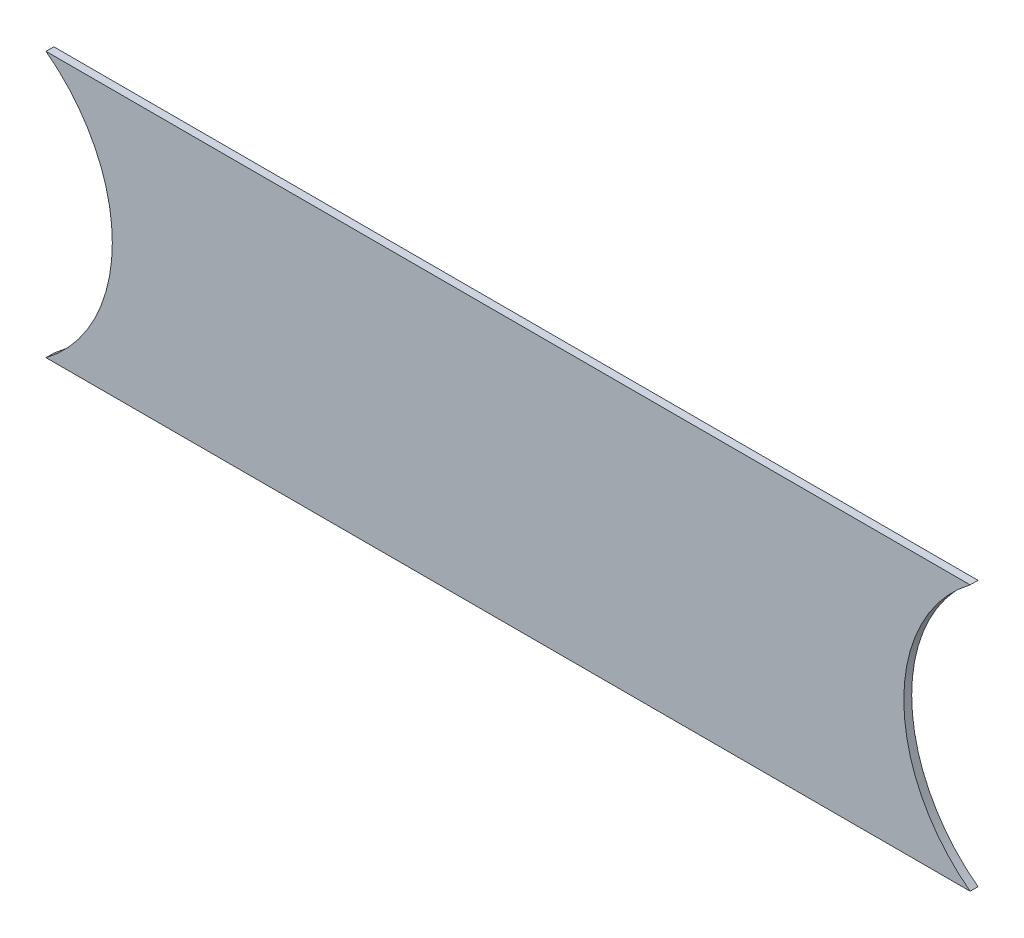
ISO-10303-21;
HEADER;
FILE_DESCRIPTION(('STEP AP214'),'2;1');
FILE_NAME('part.step','',(''),(''),'','','');
FILE_SCHEMA(('AUTOMOTIVE_DESIGN { 1 0 10303 214 1 1 1 1 }'));
ENDSEC;
DATA;
#1=APPLICATION_CONTEXT('core data for automotive mechanical design processes');
#2=APPLICATION_PROTOCOL_DEFINITION('international standard','automotive_design',2000,#1);
#3=PRODUCT_CONTEXT('',#1,'mechanical');
#4=PRODUCT('Part','Part','',(#3));
#5=PRODUCT_RELATED_PRODUCT_CATEGORY('part','',(#4));
#6=PRODUCT_DEFINITION_FORMATION('','',#4);
#7=PRODUCT_DEFINITION_CONTEXT('part definition',#1,'design');
#8=PRODUCT_DEFINITION('design','',#6,#7);
#9=PRODUCT_DEFINITION_SHAPE('','',#8);
#10=(LENGTH_UNIT() NAMED_UNIT(*) SI_UNIT(.MILLI.,.METRE.));
#11=(NAMED_UNIT(*) PLANE_ANGLE_UNIT() SI_UNIT($,.RADIAN.));
#12=(NAMED_UNIT(*) SI_UNIT($,.STERADIAN.) SOLID_ANGLE_UNIT());
#13=UNCERTAINTY_MEASURE_WITH_UNIT(LENGTH_MEASURE(1.E-05),#10,'distance_accuracy_value','');
#14=(GEOMETRIC_REPRESENTATION_CONTEXT(3) GLOBAL_UNCERTAINTY_ASSIGNED_CONTEXT((#13)) GLOBAL_UNIT_ASSIGNED_CONTEXT((#10,
#11,#12)) REPRESENTATION_CONTEXT('',''));
#15=CARTESIAN_POINT('',(0.,0.,0.));
#16=DIRECTION('',(0.,0.,1.));
#17=DIRECTION('',(1.,0.,0.));
#18=AXIS2_PLACEMENT_3D('',#15,#16,#17);
#19=CARTESIAN_POINT('',(96.8500095,41.8999924,0.));
#20=DIRECTION('',(0.,1.,0.));
#21=DIRECTION('',(1.,0.,0.));
#22=AXIS2_PLACEMENT_3D('',#19,#20,#21);
#23=PLANE('',#22);
#24=DIRECTION('',(1.,0.,0.));
#25=VECTOR('',#24,1.);
#26=CARTESIAN_POINT('',(96.4000104,41.8999924,0.03556));
#27=LINE('',#26,#25);
#28=CARTESIAN_POINT('',(96.8500095,41.8999924,0.03556));
#29=VERTEX_POINT('',#28);
#30=CARTESIAN_POINT('',(101.0300113,41.8999924,0.03556));
#31=VERTEX_POINT('',#30);
#32=EDGE_CURVE('E11',#29,#31,#27,.T.);
#33=ORIENTED_EDGE('',*,*,#32,.F.);
#34=DIRECTION('',(0.,0.,1.));
#35=VECTOR('',#34,1.);
#36=CARTESIAN_POINT('',(96.8500095,41.8999924,0.));
#37=LINE('',#36,#35);
#38=CARTESIAN_POINT('',(96.8500095,41.8999924,0.));
#39=VERTEX_POINT('',#38);
#40=EDGE_CURVE('E24',#39,#29,#37,.T.);
#41=ORIENTED_EDGE('',*,*,#40,.F.);
#42=DIRECTION('',(1.,0.,0.));
#43=VECTOR('',#42,1.);
#44=CARTESIAN_POINT('',(96.4000104,41.8999924,0.));
#45=LINE('',#44,#43);
#46=CARTESIAN_POINT('',(101.0300113,41.8999924,0.));
#47=VERTEX_POINT('',#46);
#48=EDGE_CURVE('E82',#39,#47,#45,.T.);
#49=ORIENTED_EDGE('',*,*,#48,.T.);
#50=DIRECTION('',(0.,0.,1.));
#51=VECTOR('',#50,1.);
#52=CARTESIAN_POINT('',(101.0300113,41.8999924,0.));
#53=LINE('',#52,#51);
#54=EDGE_CURVE('E37',#47,#31,#53,.T.);
#55=ORIENTED_EDGE('',*,*,#54,.T.);
#56=EDGE_LOOP('',(#33,#41,#49,#55));
#57=FACE_BOUND('',#56,.T.);
#58=ADVANCED_FACE('F17',(#57),#23,.F.);
#59=CARTESIAN_POINT('',(101.4800104,42.4999912,0.));
#60=DIRECTION('',(0.,0.,-1.));
#61=DIRECTION('',(1.,0.,0.));
#62=AXIS2_PLACEMENT_3D('',#59,#60,#61);
#63=CYLINDRICAL_SURFACE('',#62,0.7499985);
#64=DIRECTION('',(0.,0.,1.));
#65=VECTOR('',#64,1.);
#66=CARTESIAN_POINT('',(101.0300113,43.09999,0.));
#67=LINE('',#66,#65);
#68=CARTESIAN_POINT('',(101.0300113,43.09999,0.));
#69=VERTEX_POINT('',#68);
#70=CARTESIAN_POINT('',(101.0300113,43.09999,0.03556));
#71=VERTEX_POINT('',#70);
#72=EDGE_CURVE('E97',#69,#71,#67,.T.);
#73=ORIENTED_EDGE('',*,*,#72,.T.);
#74=CARTESIAN_POINT('',(101.4800104,42.4999912,0.03556));
#75=DIRECTION('',(0.,0.,1.));
#76=DIRECTION('',(1.,0.,0.));
#77=AXIS2_PLACEMENT_3D('',#74,#75,#76);
#78=CIRCLE('',#77,0.7499985);
#79=EDGE_CURVE('E94',#71,#31,#78,.T.);
#80=ORIENTED_EDGE('',*,*,#79,.T.);
#81=ORIENTED_EDGE('',*,*,#54,.F.);
#82=CARTESIAN_POINT('',(101.4800104,42.4999912,0.));
#83=DIRECTION('',(0.,0.,1.));
#84=DIRECTION('',(1.,0.,0.));
#85=AXIS2_PLACEMENT_3D('',#82,#83,#84);
#86=CIRCLE('',#85,0.7499985);
#87=EDGE_CURVE('E92',#69,#47,#86,.T.);
#88=ORIENTED_EDGE('',*,*,#87,.F.);
#89=EDGE_LOOP('',(#73,#80,#81,#88));
#90=FACE_BOUND('',#89,.T.);
#91=ADVANCED_FACE('F102',(#90),#63,.F.);
#92=CARTESIAN_POINT('',(101.0300113,43.09999,0.));
#93=DIRECTION('',(0.,-1.,0.));
#94=DIRECTION('',(-1.,0.,0.));
#95=AXIS2_PLACEMENT_3D('',#92,#93,#94);
#96=PLANE('',#95);
#97=DIRECTION('',(-1.,0.,0.));
#98=VECTOR('',#97,1.);
#99=CARTESIAN_POINT('',(101.4800104,43.09999,0.03556));
#100=LINE('',#99,#98);
#101=CARTESIAN_POINT('',(96.8500095,43.09999,0.03556));
#102=VERTEX_POINT('',#101);
#103=EDGE_CURVE('E89',#71,#102,#100,.T.);
#104=ORIENTED_EDGE('',*,*,#103,.F.);
#105=ORIENTED_EDGE('',*,*,#72,.F.);
#106=DIRECTION('',(-1.,0.,0.));
#107=VECTOR('',#106,1.);
#108=CARTESIAN_POINT('',(101.4800104,43.09999,0.));
#109=LINE('',#108,#107);
#110=CARTESIAN_POINT('',(96.8500095,43.09999,0.));
#111=VERTEX_POINT('',#110);
#112=EDGE_CURVE('E87',#69,#111,#109,.T.);
#113=ORIENTED_EDGE('',*,*,#112,.T.);
#114=DIRECTION('',(0.,0.,1.));
#115=VECTOR('',#114,1.);
#116=CARTESIAN_POINT('',(96.8500095,43.09999,0.));
#117=LINE('',#116,#115);
#118=EDGE_CURVE('E69',#111,#102,#117,.T.);
#119=ORIENTED_EDGE('',*,*,#118,.T.);
#120=EDGE_LOOP('',(#104,#105,#113,#119));
#121=FACE_BOUND('',#120,.T.);
#122=ADVANCED_FACE('F108',(#121),#96,.F.);
#123=CARTESIAN_POINT('',(96.4000104,42.4999912,0.));
#124=DIRECTION('',(0.,0.,-1.));
#125=DIRECTION('',(1.,0.,0.));
#126=AXIS2_PLACEMENT_3D('',#123,#124,#125);
#127=CYLINDRICAL_SURFACE('',#126,0.7499985);
#128=DIRECTION('',(0.,0.,1.));
#129=VECTOR('',#128,1.);
#130=CARTESIAN_POINT('',(97.1500089,42.4999912,0.));
#131=LINE('',#130,#129);
#132=CARTESIAN_POINT('',(97.1500089,42.4999912,0.));
#133=VERTEX_POINT('',#132);
#134=CARTESIAN_POINT('',(97.1500089,42.4999912,0.03556));
#135=VERTEX_POINT('',#134);
#136=EDGE_CURVE('E59',#133,#135,#131,.T.);
#137=ORIENTED_EDGE('',*,*,#136,.T.);
#138=CARTESIAN_POINT('',(96.4000104,42.4999912,0.03556));
#139=DIRECTION('',(0.,0.,1.));
#140=DIRECTION('',(1.,0.,0.));
#141=AXIS2_PLACEMENT_3D('',#138,#139,#140);
#142=CIRCLE('',#141,0.7499985);
#143=EDGE_CURVE('E70',#135,#102,#142,.T.);
#144=ORIENTED_EDGE('',*,*,#143,.T.);
#145=ORIENTED_EDGE('',*,*,#118,.F.);
#146=CARTESIAN_POINT('',(96.4000104,42.4999912,0.));
#147=DIRECTION('',(0.,0.,1.));
#148=DIRECTION('',(1.,0.,0.));
#149=AXIS2_PLACEMENT_3D('',#146,#147,#148);
#150=CIRCLE('',#149,0.7499985);
#151=EDGE_CURVE('E73',#133,#111,#150,.T.);
#152=ORIENTED_EDGE('',*,*,#151,.F.);
#153=EDGE_LOOP('',(#137,#144,#145,#152));
#154=FACE_BOUND('',#153,.T.);
#155=ADVANCED_FACE('F74',(#154),#127,.F.);
#156=CARTESIAN_POINT('',(96.4000104,42.4999912,0.));
#157=DIRECTION('',(0.,0.,-1.));
#158=DIRECTION('',(1.,0.,0.));
#159=AXIS2_PLACEMENT_3D('',#156,#157,#158);
#160=CYLINDRICAL_SURFACE('',#159,0.7499985);
#161=ORIENTED_EDGE('',*,*,#40,.T.);
#162=CARTESIAN_POINT('',(96.4000104,42.4999912,0.03556));
#163=DIRECTION('',(0.,0.,1.));
#164=DIRECTION('',(1.,0.,0.));
#165=AXIS2_PLACEMENT_3D('',#162,#163,#164);
#166=CIRCLE('',#165,0.7499985);
#167=EDGE_CURVE('E65',#29,#135,#166,.T.);
#168=ORIENTED_EDGE('',*,*,#167,.T.);
#169=ORIENTED_EDGE('',*,*,#136,.F.);
#170=EDGE_CURVE('E63',#39,#133,#150,.T.);
#171=ORIENTED_EDGE('',*,*,#170,.F.);
#172=EDGE_LOOP('',(#161,#168,#169,#171));
#173=FACE_BOUND('',#172,.T.);
#174=ADVANCED_FACE('F61',(#173),#160,.F.);
#175=CARTESIAN_POINT('',(96.4000104,41.8999924,0.));
#176=DIRECTION('',(0.,0.,-1.));
#177=DIRECTION('',(-1.,0.,0.));
#178=AXIS2_PLACEMENT_3D('',#175,#176,#177);
#179=PLANE('',#178);
#180=ORIENTED_EDGE('',*,*,#48,.F.);
#181=ORIENTED_EDGE('',*,*,#170,.T.);
#182=ORIENTED_EDGE('',*,*,#151,.T.);
#183=ORIENTED_EDGE('',*,*,#112,.F.);
#184=ORIENTED_EDGE('',*,*,#87,.T.);
#185=EDGE_LOOP('',(#180,#181,#182,#183,#184));
#186=FACE_BOUND('',#185,.T.);
#187=ADVANCED_FACE('F80',(#186),#179,.T.);
#188=CARTESIAN_POINT('',(96.4000104,41.8999924,0.03556));
#189=DIRECTION('',(0.,0.,-1.));
#190=DIRECTION('',(-1.,0.,0.));
#191=AXIS2_PLACEMENT_3D('',#188,#189,#190);
#192=PLANE('',#191);
#193=ORIENTED_EDGE('',*,*,#167,.F.);
#194=ORIENTED_EDGE('',*,*,#32,.T.);
#195=ORIENTED_EDGE('',*,*,#79,.F.);
#196=ORIENTED_EDGE('',*,*,#103,.T.);
#197=ORIENTED_EDGE('',*,*,#143,.F.);
#198=EDGE_LOOP('',(#193,#194,#195,#196,#197));
#199=FACE_BOUND('',#198,.T.);
#200=ADVANCED_FACE('F106',(#199),#192,.F.);
#201=CLOSED_SHELL('',(#58,#91,#122,#155,#174,#187,#200));
#202=MANIFOLD_SOLID_BREP('B1',#201);
#203=ADVANCED_BREP_SHAPE_REPRESENTATION('',(#18,#202),#14);
#204=SHAPE_DEFINITION_REPRESENTATION(#9,#203);
ENDSEC;
END-ISO-10303-21;
